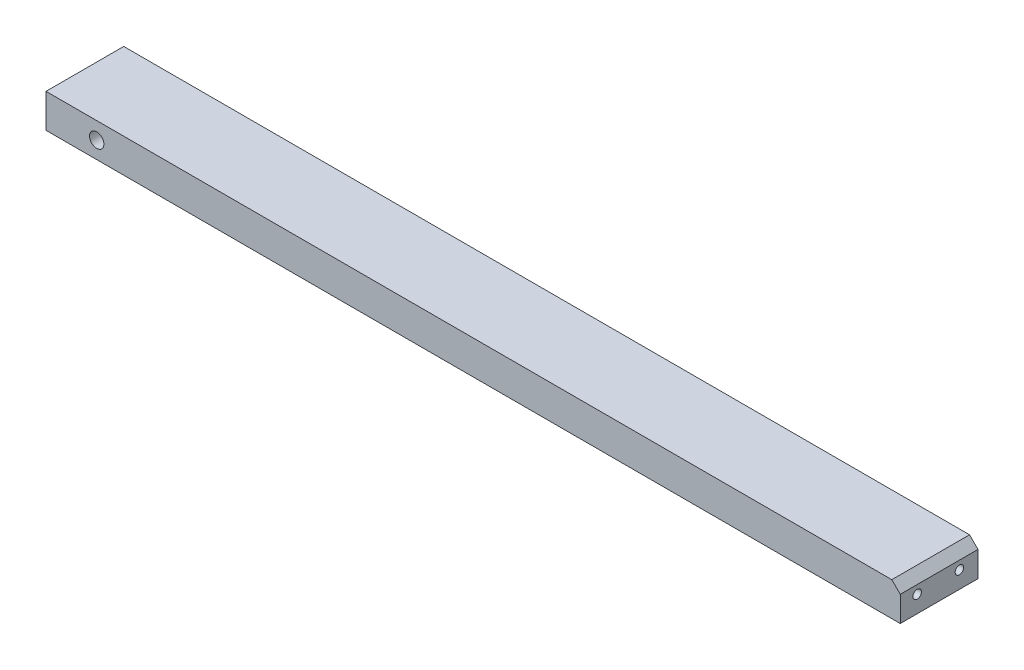
ISO-10303-21;
HEADER;
FILE_DESCRIPTION(('STEP AP214'),'2;1');
FILE_NAME('part.step','',(''),(''),'','','');
FILE_SCHEMA(('AUTOMOTIVE_DESIGN { 1 0 10303 214 1 1 1 1 }'));
ENDSEC;
DATA;
#1=APPLICATION_CONTEXT('core data for automotive mechanical design processes');
#2=APPLICATION_PROTOCOL_DEFINITION('international standard','automotive_design',2000,#1);
#3=PRODUCT_CONTEXT('',#1,'mechanical');
#4=PRODUCT('Part','Part','',(#3));
#5=PRODUCT_RELATED_PRODUCT_CATEGORY('part','',(#4));
#6=PRODUCT_DEFINITION_FORMATION('','',#4);
#7=PRODUCT_DEFINITION_CONTEXT('part definition',#1,'design');
#8=PRODUCT_DEFINITION('design','',#6,#7);
#9=PRODUCT_DEFINITION_SHAPE('','',#8);
#10=(LENGTH_UNIT() NAMED_UNIT(*) SI_UNIT(.MILLI.,.METRE.));
#11=(NAMED_UNIT(*) PLANE_ANGLE_UNIT() SI_UNIT($,.RADIAN.));
#12=(NAMED_UNIT(*) SI_UNIT($,.STERADIAN.) SOLID_ANGLE_UNIT());
#13=UNCERTAINTY_MEASURE_WITH_UNIT(LENGTH_MEASURE(1.E-05),#10,'distance_accuracy_value','');
#14=(GEOMETRIC_REPRESENTATION_CONTEXT(3) GLOBAL_UNCERTAINTY_ASSIGNED_CONTEXT((#13)) GLOBAL_UNIT_ASSIGNED_CONTEXT((#10,
#11,#12)) REPRESENTATION_CONTEXT('',''));
#15=CARTESIAN_POINT('',(0.,0.,0.));
#16=DIRECTION('',(0.,0.,1.));
#17=DIRECTION('',(1.,0.,0.));
#18=AXIS2_PLACEMENT_3D('',#15,#16,#17);
#19=CARTESIAN_POINT('',(-252.75,9.99999999999998,46.));
#20=DIRECTION('',(1.,0.,0.));
#21=DIRECTION('',(0.,0.,-1.));
#22=AXIS2_PLACEMENT_3D('',#19,#20,#21);
#23=PLANE('',#22);
#24=CARTESIAN_POINT('',(-252.75,0.,36.));
#25=DIRECTION('',(-1.,0.,0.));
#26=DIRECTION('',(0.,0.,1.));
#27=AXIS2_PLACEMENT_3D('',#24,#25,#26);
#28=CIRCLE('',#27,4.);
#29=CARTESIAN_POINT('',(-252.75,0.,40.));
#30=VERTEX_POINT('',#29);
#31=EDGE_CURVE('E126',#30,#30,#28,.T.);
#32=ORIENTED_EDGE('',*,*,#31,.F.);
#33=EDGE_LOOP('',(#32));
#34=FACE_BOUND('',#33,.T.);
#35=CARTESIAN_POINT('',(-252.75,0.,11.));
#36=DIRECTION('',(-1.,0.,0.));
#37=DIRECTION('',(0.,0.,1.));
#38=AXIS2_PLACEMENT_3D('',#35,#36,#37);
#39=CIRCLE('',#38,5.025);
#40=CARTESIAN_POINT('',(-252.75,0.,16.025));
#41=VERTEX_POINT('',#40);
#42=EDGE_CURVE('E132',#41,#41,#39,.T.);
#43=ORIENTED_EDGE('',*,*,#42,.F.);
#44=EDGE_LOOP('',(#43));
#45=FACE_BOUND('',#44,.T.);
#46=DIRECTION('',(0.,-1.,0.));
#47=VECTOR('',#46,1.);
#48=CARTESIAN_POINT('',(-252.75,9.99999999999998,0.));
#49=LINE('',#48,#47);
#50=CARTESIAN_POINT('',(-252.75,9.99999999999998,0.));
#51=VERTEX_POINT('',#50);
#52=CARTESIAN_POINT('',(-252.75,-10.,0.));
#53=VERTEX_POINT('',#52);
#54=EDGE_CURVE('E141',#51,#53,#49,.T.);
#55=ORIENTED_EDGE('',*,*,#54,.T.);
#56=DIRECTION('',(0.,0.,-1.));
#57=VECTOR('',#56,1.);
#58=CARTESIAN_POINT('',(-252.75,-10.,46.));
#59=LINE('',#58,#57);
#60=CARTESIAN_POINT('',(-252.75,-10.,46.));
#61=VERTEX_POINT('',#60);
#62=EDGE_CURVE('E165',#61,#53,#59,.T.);
#63=ORIENTED_EDGE('',*,*,#62,.F.);
#64=DIRECTION('',(0.,-1.,0.));
#65=VECTOR('',#64,1.);
#66=CARTESIAN_POINT('',(-252.75,9.99999999999998,46.));
#67=LINE('',#66,#65);
#68=CARTESIAN_POINT('',(-252.75,9.99999999999998,46.));
#69=VERTEX_POINT('',#68);
#70=EDGE_CURVE('E142',#69,#61,#67,.T.);
#71=ORIENTED_EDGE('',*,*,#70,.F.);
#72=DIRECTION('',(0.,0.,-1.));
#73=VECTOR('',#72,1.);
#74=CARTESIAN_POINT('',(-252.75,9.99999999999998,46.));
#75=LINE('',#74,#73);
#76=EDGE_CURVE('E152',#69,#51,#75,.T.);
#77=ORIENTED_EDGE('',*,*,#76,.T.);
#78=EDGE_LOOP('',(#55,#63,#71,#77));
#79=FACE_BOUND('',#78,.T.);
#80=ADVANCED_FACE('F39',(#34,#45,#79),#23,.F.);
#81=CARTESIAN_POINT('',(-252.75,-10.,46.));
#82=DIRECTION('',(0.,1.,0.));
#83=DIRECTION('',(0.,0.,1.));
#84=AXIS2_PLACEMENT_3D('',#81,#82,#83);
#85=PLANE('',#84);
#86=DIRECTION('',(1.,0.,0.));
#87=VECTOR('',#86,1.);
#88=CARTESIAN_POINT('',(-252.75,-10.,0.));
#89=LINE('',#88,#87);
#90=CARTESIAN_POINT('',(252.75,-10.,0.));
#91=VERTEX_POINT('',#90);
#92=EDGE_CURVE('E155',#53,#91,#89,.T.);
#93=ORIENTED_EDGE('',*,*,#92,.T.);
#94=DIRECTION('',(0.,0.,-1.));
#95=VECTOR('',#94,1.);
#96=CARTESIAN_POINT('',(252.75,-10.,46.));
#97=LINE('',#96,#95);
#98=CARTESIAN_POINT('',(252.75,-10.,46.));
#99=VERTEX_POINT('',#98);
#100=EDGE_CURVE('E162',#99,#91,#97,.T.);
#101=ORIENTED_EDGE('',*,*,#100,.F.);
#102=DIRECTION('',(1.,0.,0.));
#103=VECTOR('',#102,1.);
#104=CARTESIAN_POINT('',(-252.75,-10.,46.));
#105=LINE('',#104,#103);
#106=EDGE_CURVE('E145',#61,#99,#105,.T.);
#107=ORIENTED_EDGE('',*,*,#106,.F.);
#108=ORIENTED_EDGE('',*,*,#62,.T.);
#109=EDGE_LOOP('',(#93,#101,#107,#108));
#110=FACE_BOUND('',#109,.T.);
#111=ADVANCED_FACE('F192',(#110),#85,.F.);
#112=CARTESIAN_POINT('',(252.75,9.99999999999998,46.));
#113=DIRECTION('',(-1.,0.,0.));
#114=DIRECTION('',(0.,0.,1.));
#115=AXIS2_PLACEMENT_3D('',#112,#113,#114);
#116=PLANE('',#115);
#117=CARTESIAN_POINT('',(252.75,0.,11.));
#118=DIRECTION('',(1.,0.,0.));
#119=DIRECTION('',(0.,0.,-1.));
#120=AXIS2_PLACEMENT_3D('',#117,#118,#119);
#121=CIRCLE('',#120,2.5);
#122=CARTESIAN_POINT('',(252.75,0.,8.5));
#123=VERTEX_POINT('',#122);
#124=EDGE_CURVE('E110',#123,#123,#121,.T.);
#125=ORIENTED_EDGE('',*,*,#124,.F.);
#126=EDGE_LOOP('',(#125));
#127=FACE_BOUND('',#126,.T.);
#128=CARTESIAN_POINT('',(252.75,0.,36.));
#129=DIRECTION('',(1.,0.,0.));
#130=DIRECTION('',(0.,0.,-1.));
#131=AXIS2_PLACEMENT_3D('',#128,#129,#130);
#132=CIRCLE('',#131,2.5);
#133=CARTESIAN_POINT('',(252.75,0.,33.5));
#134=VERTEX_POINT('',#133);
#135=EDGE_CURVE('E109',#134,#134,#132,.T.);
#136=ORIENTED_EDGE('',*,*,#135,.F.);
#137=EDGE_LOOP('',(#136));
#138=FACE_BOUND('',#137,.T.);
#139=DIRECTION('',(0.,1.,0.));
#140=VECTOR('',#139,1.);
#141=CARTESIAN_POINT('',(252.75,9.99999999999998,0.));
#142=LINE('',#141,#140);
#143=CARTESIAN_POINT('',(252.75,5.00000000000004,0.));
#144=VERTEX_POINT('',#143);
#145=EDGE_CURVE('E157',#91,#144,#142,.T.);
#146=ORIENTED_EDGE('',*,*,#145,.T.);
#147=DIRECTION('',(0.,0.,1.));
#148=VECTOR('',#147,1.);
#149=CARTESIAN_POINT('',(252.75,5.00000000000004,46.));
#150=LINE('',#149,#148);
#151=CARTESIAN_POINT('',(252.75,5.00000000000004,46.));
#152=VERTEX_POINT('',#151);
#153=EDGE_CURVE('E47',#144,#152,#150,.T.);
#154=ORIENTED_EDGE('',*,*,#153,.T.);
#155=DIRECTION('',(0.,1.,0.));
#156=VECTOR('',#155,1.);
#157=CARTESIAN_POINT('',(252.75,9.99999999999998,46.));
#158=LINE('',#157,#156);
#159=EDGE_CURVE('E148',#99,#152,#158,.T.);
#160=ORIENTED_EDGE('',*,*,#159,.F.);
#161=ORIENTED_EDGE('',*,*,#100,.T.);
#162=EDGE_LOOP('',(#146,#154,#160,#161));
#163=FACE_BOUND('',#162,.T.);
#164=ADVANCED_FACE('F197',(#127,#138,#163),#116,.F.);
#165=CARTESIAN_POINT('',(-252.75,9.99999999999998,46.));
#166=DIRECTION('',(0.,-1.,0.));
#167=DIRECTION('',(0.,0.,-1.));
#168=AXIS2_PLACEMENT_3D('',#165,#166,#167);
#169=PLANE('',#168);
#170=DIRECTION('',(-1.,0.,0.));
#171=VECTOR('',#170,1.);
#172=CARTESIAN_POINT('',(-252.75,9.99999999999998,46.));
#173=LINE('',#172,#171);
#174=CARTESIAN_POINT('',(247.75,9.99999999999998,46.));
#175=VERTEX_POINT('',#174);
#176=EDGE_CURVE('E150',#175,#69,#173,.T.);
#177=ORIENTED_EDGE('',*,*,#176,.F.);
#178=DIRECTION('',(0.,0.,-1.));
#179=VECTOR('',#178,1.);
#180=CARTESIAN_POINT('',(247.75,9.99999999999998,46.));
#181=LINE('',#180,#179);
#182=CARTESIAN_POINT('',(247.75,9.99999999999998,0.));
#183=VERTEX_POINT('',#182);
#184=EDGE_CURVE('E168',#175,#183,#181,.T.);
#185=ORIENTED_EDGE('',*,*,#184,.T.);
#186=DIRECTION('',(-1.,0.,0.));
#187=VECTOR('',#186,1.);
#188=CARTESIAN_POINT('',(-252.75,9.99999999999998,0.));
#189=LINE('',#188,#187);
#190=EDGE_CURVE('E146',#183,#51,#189,.T.);
#191=ORIENTED_EDGE('',*,*,#190,.T.);
#192=ORIENTED_EDGE('',*,*,#76,.F.);
#193=EDGE_LOOP('',(#177,#185,#191,#192));
#194=FACE_BOUND('',#193,.T.);
#195=ADVANCED_FACE('F174',(#194),#169,.F.);
#196=CARTESIAN_POINT('',(-252.75,-10.,46.));
#197=DIRECTION('',(0.,0.,1.));
#198=DIRECTION('',(1.,0.,0.));
#199=AXIS2_PLACEMENT_3D('',#196,#197,#198);
#200=PLANE('',#199);
#201=CARTESIAN_POINT('',(-222.75,0.,46.));
#202=DIRECTION('',(0.,0.,1.));
#203=DIRECTION('',(1.,0.,0.));
#204=AXIS2_PLACEMENT_3D('',#201,#202,#203);
#205=CIRCLE('',#204,4.25);
#206=CARTESIAN_POINT('',(-218.5,0.,46.));
#207=VERTEX_POINT('',#206);
#208=EDGE_CURVE('E120',#207,#207,#205,.T.);
#209=ORIENTED_EDGE('',*,*,#208,.F.);
#210=EDGE_LOOP('',(#209));
#211=FACE_BOUND('',#210,.T.);
#212=ORIENTED_EDGE('',*,*,#159,.T.);
#213=DIRECTION('',(0.707106781186551,-0.707106781186544,0.));
#214=VECTOR('',#213,1.);
#215=CARTESIAN_POINT('',(7.49999999999718,250.25,46.));
#216=LINE('',#215,#214);
#217=EDGE_CURVE('E11',#152,#175,#216,.F.);
#218=ORIENTED_EDGE('',*,*,#217,.T.);
#219=ORIENTED_EDGE('',*,*,#176,.T.);
#220=ORIENTED_EDGE('',*,*,#70,.T.);
#221=ORIENTED_EDGE('',*,*,#106,.T.);
#222=EDGE_LOOP('',(#212,#218,#219,#220,#221));
#223=FACE_BOUND('',#222,.T.);
#224=ADVANCED_FACE('F184',(#211,#223),#200,.T.);
#225=CARTESIAN_POINT('',(-252.75,-10.,0.));
#226=DIRECTION('',(0.,0.,1.));
#227=DIRECTION('',(1.,0.,0.));
#228=AXIS2_PLACEMENT_3D('',#225,#226,#227);
#229=PLANE('',#228);
#230=ORIENTED_EDGE('',*,*,#190,.F.);
#231=DIRECTION('',(-0.707106781186551,0.707106781186544,0.));
#232=VECTOR('',#231,1.);
#233=CARTESIAN_POINT('',(247.75,9.99999999999998,0.));
#234=LINE('',#233,#232);
#235=EDGE_CURVE('E61',#183,#144,#234,.F.);
#236=ORIENTED_EDGE('',*,*,#235,.T.);
#237=ORIENTED_EDGE('',*,*,#145,.F.);
#238=ORIENTED_EDGE('',*,*,#92,.F.);
#239=ORIENTED_EDGE('',*,*,#54,.F.);
#240=EDGE_LOOP('',(#230,#236,#237,#238,#239));
#241=FACE_BOUND('',#240,.T.);
#242=ADVANCED_FACE('F179',(#241),#229,.F.);
#243=CARTESIAN_POINT('',(-225.25,0.,11.));
#244=DIRECTION('',(-1.,0.,0.));
#245=DIRECTION('',(0.,0.,1.));
#246=AXIS2_PLACEMENT_3D('',#243,#244,#245);
#247=CONICAL_SURFACE('',#246,4.24999999999999,1.02974425867665);
#248=CARTESIAN_POINT('',(-222.696342369133,0.,11.));
#249=VERTEX_POINT('',#248);
#250=VERTEX_LOOP('',#249);
#251=FACE_BOUND('',#250,.T.);
#252=CARTESIAN_POINT('',(-225.25,0.,11.));
#253=DIRECTION('',(-1.,0.,0.));
#254=DIRECTION('',(0.,0.,1.));
#255=AXIS2_PLACEMENT_3D('',#252,#253,#254);
#256=CIRCLE('',#255,4.24999999999999);
#257=CARTESIAN_POINT('',(-225.25,0.,15.25));
#258=VERTEX_POINT('',#257);
#259=EDGE_CURVE('E138',#258,#258,#256,.T.);
#260=ORIENTED_EDGE('',*,*,#259,.T.);
#261=EDGE_LOOP('',(#260));
#262=FACE_BOUND('',#261,.T.);
#263=ADVANCED_FACE('F210',(#251,#262),#247,.F.);
#264=CARTESIAN_POINT('',(-252.75,0.,11.));
#265=DIRECTION('',(-1.,0.,0.));
#266=DIRECTION('',(0.,0.,1.));
#267=AXIS2_PLACEMENT_3D('',#264,#265,#266);
#268=CYLINDRICAL_SURFACE('',#267,4.25);
#269=ORIENTED_EDGE('',*,*,#259,.F.);
#270=EDGE_LOOP('',(#269));
#271=FACE_BOUND('',#270,.T.);
#272=CARTESIAN_POINT('',(-251.975,0.,11.));
#273=DIRECTION('',(-1.,0.,0.));
#274=DIRECTION('',(0.,0.,1.));
#275=AXIS2_PLACEMENT_3D('',#272,#273,#274);
#276=CIRCLE('',#275,4.25);
#277=CARTESIAN_POINT('',(-251.975,0.,15.25));
#278=VERTEX_POINT('',#277);
#279=EDGE_CURVE('E135',#278,#278,#276,.T.);
#280=ORIENTED_EDGE('',*,*,#279,.T.);
#281=EDGE_LOOP('',(#280));
#282=FACE_BOUND('',#281,.T.);
#283=ADVANCED_FACE('F216',(#271,#282),#268,.F.);
#284=CARTESIAN_POINT('',(-252.75,0.,11.));
#285=DIRECTION('',(-1.,0.,0.));
#286=DIRECTION('',(0.,0.,1.));
#287=AXIS2_PLACEMENT_3D('',#284,#285,#286);
#288=CONICAL_SURFACE('',#287,5.025,0.785398163397434);
#289=ORIENTED_EDGE('',*,*,#279,.F.);
#290=EDGE_LOOP('',(#289));
#291=FACE_BOUND('',#290,.T.);
#292=ORIENTED_EDGE('',*,*,#42,.T.);
#293=EDGE_LOOP('',(#292));
#294=FACE_BOUND('',#293,.T.);
#295=ADVANCED_FACE('F220',(#291,#294),#288,.F.);
#296=CARTESIAN_POINT('',(-242.75,0.,36.));
#297=DIRECTION('',(-1.,0.,0.));
#298=DIRECTION('',(0.,0.,1.));
#299=AXIS2_PLACEMENT_3D('',#296,#297,#298);
#300=CONICAL_SURFACE('',#299,4.,1.02974425867665);
#301=CARTESIAN_POINT('',(-240.34655752389,0.,36.));
#302=VERTEX_POINT('',#301);
#303=VERTEX_LOOP('',#302);
#304=FACE_BOUND('',#303,.T.);
#305=CARTESIAN_POINT('',(-242.75,0.,36.));
#306=DIRECTION('',(-1.,0.,0.));
#307=DIRECTION('',(0.,0.,1.));
#308=AXIS2_PLACEMENT_3D('',#305,#306,#307);
#309=CIRCLE('',#308,4.);
#310=CARTESIAN_POINT('',(-242.75,0.,40.));
#311=VERTEX_POINT('',#310);
#312=EDGE_CURVE('E129',#311,#311,#309,.T.);
#313=ORIENTED_EDGE('',*,*,#312,.T.);
#314=EDGE_LOOP('',(#313));
#315=FACE_BOUND('',#314,.T.);
#316=ADVANCED_FACE('F224',(#304,#315),#300,.F.);
#317=CARTESIAN_POINT('',(-252.75,0.,36.));
#318=DIRECTION('',(-1.,0.,0.));
#319=DIRECTION('',(0.,0.,1.));
#320=AXIS2_PLACEMENT_3D('',#317,#318,#319);
#321=CYLINDRICAL_SURFACE('',#320,4.);
#322=ORIENTED_EDGE('',*,*,#312,.F.);
#323=EDGE_LOOP('',(#322));
#324=FACE_BOUND('',#323,.T.);
#325=ORIENTED_EDGE('',*,*,#31,.T.);
#326=EDGE_LOOP('',(#325));
#327=FACE_BOUND('',#326,.T.);
#328=ADVANCED_FACE('F228',(#324,#327),#321,.F.);
#329=CARTESIAN_POINT('',(-222.75,0.,18.5));
#330=DIRECTION('',(0.,0.,1.));
#331=DIRECTION('',(1.,0.,0.));
#332=AXIS2_PLACEMENT_3D('',#329,#330,#331);
#333=CONICAL_SURFACE('',#332,4.25,1.02974425867666);
#334=CARTESIAN_POINT('',(-222.75,0.,15.9463423691329));
#335=VERTEX_POINT('',#334);
#336=VERTEX_LOOP('',#335);
#337=FACE_BOUND('',#336,.T.);
#338=CARTESIAN_POINT('',(-222.75,0.,18.5));
#339=DIRECTION('',(0.,0.,1.));
#340=DIRECTION('',(1.,0.,0.));
#341=AXIS2_PLACEMENT_3D('',#338,#339,#340);
#342=CIRCLE('',#341,4.25);
#343=CARTESIAN_POINT('',(-218.5,0.,18.5));
#344=VERTEX_POINT('',#343);
#345=EDGE_CURVE('E123',#344,#344,#342,.T.);
#346=ORIENTED_EDGE('',*,*,#345,.T.);
#347=EDGE_LOOP('',(#346));
#348=FACE_BOUND('',#347,.T.);
#349=ADVANCED_FACE('F232',(#337,#348),#333,.F.);
#350=CARTESIAN_POINT('',(-222.75,0.,46.));
#351=DIRECTION('',(0.,0.,1.));
#352=DIRECTION('',(1.,0.,0.));
#353=AXIS2_PLACEMENT_3D('',#350,#351,#352);
#354=CYLINDRICAL_SURFACE('',#353,4.25);
#355=ORIENTED_EDGE('',*,*,#345,.F.);
#356=EDGE_LOOP('',(#355));
#357=FACE_BOUND('',#356,.T.);
#358=ORIENTED_EDGE('',*,*,#208,.T.);
#359=EDGE_LOOP('',(#358));
#360=FACE_BOUND('',#359,.T.);
#361=ADVANCED_FACE('F236',(#357,#360),#354,.F.);
#362=CARTESIAN_POINT('',(235.75,0.,36.));
#363=DIRECTION('',(1.,0.,0.));
#364=DIRECTION('',(0.,0.,-1.));
#365=AXIS2_PLACEMENT_3D('',#362,#363,#364);
#366=CONICAL_SURFACE('',#365,2.49999999999999,1.02974425867666);
#367=CARTESIAN_POINT('',(234.247848452431,0.,36.));
#368=VERTEX_POINT('',#367);
#369=VERTEX_LOOP('',#368);
#370=FACE_BOUND('',#369,.T.);
#371=CARTESIAN_POINT('',(235.75,0.,36.));
#372=DIRECTION('',(1.,0.,0.));
#373=DIRECTION('',(0.,0.,-1.));
#374=AXIS2_PLACEMENT_3D('',#371,#372,#373);
#375=CIRCLE('',#374,2.49999999999999);
#376=CARTESIAN_POINT('',(235.75,0.,33.5));
#377=VERTEX_POINT('',#376);
#378=EDGE_CURVE('E113',#377,#377,#375,.T.);
#379=ORIENTED_EDGE('',*,*,#378,.T.);
#380=EDGE_LOOP('',(#379));
#381=FACE_BOUND('',#380,.T.);
#382=ADVANCED_FACE('F240',(#370,#381),#366,.F.);
#383=CARTESIAN_POINT('',(252.75,0.,36.));
#384=DIRECTION('',(1.,0.,0.));
#385=DIRECTION('',(0.,0.,-1.));
#386=AXIS2_PLACEMENT_3D('',#383,#384,#385);
#387=CYLINDRICAL_SURFACE('',#386,2.5);
#388=ORIENTED_EDGE('',*,*,#378,.F.);
#389=EDGE_LOOP('',(#388));
#390=FACE_BOUND('',#389,.T.);
#391=ORIENTED_EDGE('',*,*,#135,.T.);
#392=EDGE_LOOP('',(#391));
#393=FACE_BOUND('',#392,.T.);
#394=ADVANCED_FACE('F103',(#390,#393),#387,.F.);
#395=CARTESIAN_POINT('',(235.75,0.,11.));
#396=DIRECTION('',(1.,0.,0.));
#397=DIRECTION('',(0.,0.,-1.));
#398=AXIS2_PLACEMENT_3D('',#395,#396,#397);
#399=CONICAL_SURFACE('',#398,2.49999999999999,1.02974425867666);
#400=CARTESIAN_POINT('',(234.247848452431,0.,11.));
#401=VERTEX_POINT('',#400);
#402=VERTEX_LOOP('',#401);
#403=FACE_BOUND('',#402,.T.);
#404=CARTESIAN_POINT('',(235.75,0.,11.));
#405=DIRECTION('',(1.,0.,0.));
#406=DIRECTION('',(0.,0.,-1.));
#407=AXIS2_PLACEMENT_3D('',#404,#405,#406);
#408=CIRCLE('',#407,2.49999999999999);
#409=CARTESIAN_POINT('',(235.75,0.,8.5));
#410=VERTEX_POINT('',#409);
#411=EDGE_CURVE('E107',#410,#410,#408,.T.);
#412=ORIENTED_EDGE('',*,*,#411,.T.);
#413=EDGE_LOOP('',(#412));
#414=FACE_BOUND('',#413,.T.);
#415=ADVANCED_FACE('F99',(#403,#414),#399,.F.);
#416=CARTESIAN_POINT('',(252.75,0.,11.));
#417=DIRECTION('',(1.,0.,0.));
#418=DIRECTION('',(0.,0.,-1.));
#419=AXIS2_PLACEMENT_3D('',#416,#417,#418);
#420=CYLINDRICAL_SURFACE('',#419,2.5);
#421=ORIENTED_EDGE('',*,*,#411,.F.);
#422=EDGE_LOOP('',(#421));
#423=FACE_BOUND('',#422,.T.);
#424=ORIENTED_EDGE('',*,*,#124,.T.);
#425=EDGE_LOOP('',(#424));
#426=FACE_BOUND('',#425,.T.);
#427=ADVANCED_FACE('F102',(#423,#426),#420,.F.);
#428=CARTESIAN_POINT('',(247.75,9.99999999999998,46.));
#429=DIRECTION('',(-0.707106781186544,-0.707106781186551,0.));
#430=DIRECTION('',(0.,0.,-1.));
#431=AXIS2_PLACEMENT_3D('',#428,#429,#430);
#432=PLANE('',#431);
#433=ORIENTED_EDGE('',*,*,#217,.F.);
#434=ORIENTED_EDGE('',*,*,#153,.F.);
#435=ORIENTED_EDGE('',*,*,#235,.F.);
#436=ORIENTED_EDGE('',*,*,#184,.F.);
#437=EDGE_LOOP('',(#433,#434,#435,#436));
#438=FACE_BOUND('',#437,.T.);
#439=ADVANCED_FACE('F41',(#438),#432,.F.);
#440=CLOSED_SHELL('',(#80,#111,#164,#195,#224,#242,#263,#283,#295,#316,#328,#349,#361,#382,#394,
#415,#427,#439));
#441=MANIFOLD_SOLID_BREP('B2',#440);
#442=ADVANCED_BREP_SHAPE_REPRESENTATION('',(#18,#441),#14);
#443=SHAPE_DEFINITION_REPRESENTATION(#9,#442);
ENDSEC;
END-ISO-10303-21;
